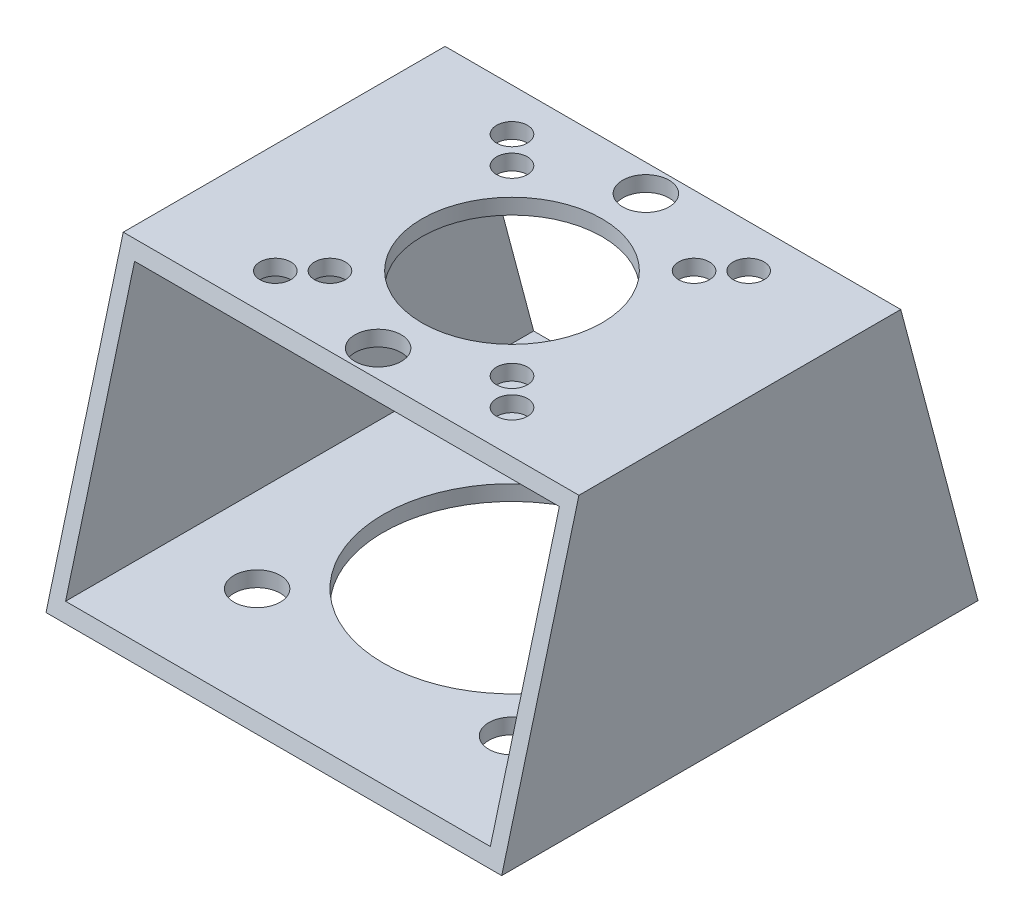
ISO-10303-21;
HEADER;
FILE_DESCRIPTION(('STEP AP214'),'2;1');
FILE_NAME('part.step','',(''),(''),'','','');
FILE_SCHEMA(('AUTOMOTIVE_DESIGN { 1 0 10303 214 1 1 1 1 }'));
ENDSEC;
DATA;
#1=APPLICATION_CONTEXT('core data for automotive mechanical design processes');
#2=APPLICATION_PROTOCOL_DEFINITION('international standard','automotive_design',2000,#1);
#3=PRODUCT_CONTEXT('',#1,'mechanical');
#4=PRODUCT('Part','Part','',(#3));
#5=PRODUCT_RELATED_PRODUCT_CATEGORY('part','',(#4));
#6=PRODUCT_DEFINITION_FORMATION('','',#4);
#7=PRODUCT_DEFINITION_CONTEXT('part definition',#1,'design');
#8=PRODUCT_DEFINITION('design','',#6,#7);
#9=PRODUCT_DEFINITION_SHAPE('','',#8);
#10=(LENGTH_UNIT() NAMED_UNIT(*) SI_UNIT(.MILLI.,.METRE.));
#11=(NAMED_UNIT(*) PLANE_ANGLE_UNIT() SI_UNIT($,.RADIAN.));
#12=(NAMED_UNIT(*) SI_UNIT($,.STERADIAN.) SOLID_ANGLE_UNIT());
#13=UNCERTAINTY_MEASURE_WITH_UNIT(LENGTH_MEASURE(1.E-05),#10,'distance_accuracy_value','');
#14=(GEOMETRIC_REPRESENTATION_CONTEXT(3) GLOBAL_UNCERTAINTY_ASSIGNED_CONTEXT((#13)) GLOBAL_UNIT_ASSIGNED_CONTEXT((#10,
#11,#12)) REPRESENTATION_CONTEXT('',''));
#15=CARTESIAN_POINT('',(0.,0.,0.));
#16=DIRECTION('',(0.,0.,1.));
#17=DIRECTION('',(1.,0.,0.));
#18=AXIS2_PLACEMENT_3D('',#15,#16,#17);
#19=CARTESIAN_POINT('',(88.5,0.,92.5));
#20=DIRECTION('',(-1.,0.,0.));
#21=DIRECTION('',(0.,0.,1.));
#22=AXIS2_PLACEMENT_3D('',#19,#20,#21);
#23=PLANE('',#22);
#24=DIRECTION('',(0.,0.966489539401314,-0.256705999594547));
#25=VECTOR('',#24,1.);
#26=CARTESIAN_POINT('',(88.5,-56.4745004554529,92.5));
#27=LINE('',#26,#25);
#28=CARTESIAN_POINT('',(88.5,-56.4745004554529,92.5));
#29=VERTEX_POINT('',#28);
#30=CARTESIAN_POINT('',(88.5,56.4745004554528,62.5));
#31=VERTEX_POINT('',#30);
#32=EDGE_CURVE('E123',#29,#31,#27,.T.);
#33=ORIENTED_EDGE('',*,*,#32,.F.);
#34=DIRECTION('',(0.,0.,-1.));
#35=VECTOR('',#34,1.);
#36=CARTESIAN_POINT('',(88.5,-56.4745004554529,92.5));
#37=LINE('',#36,#35);
#38=CARTESIAN_POINT('',(88.5,-56.4745004554529,-92.5));
#39=VERTEX_POINT('',#38);
#40=EDGE_CURVE('E279',#29,#39,#37,.T.);
#41=ORIENTED_EDGE('',*,*,#40,.T.);
#42=DIRECTION('',(0.,0.966489539401314,0.256705999594547));
#43=VECTOR('',#42,1.);
#44=CARTESIAN_POINT('',(88.5,-56.4745004554529,-92.5));
#45=LINE('',#44,#43);
#46=CARTESIAN_POINT('',(88.5,56.4745004554528,-62.5));
#47=VERTEX_POINT('',#46);
#48=EDGE_CURVE('E146',#39,#47,#45,.T.);
#49=ORIENTED_EDGE('',*,*,#48,.T.);
#50=DIRECTION('',(0.,0.,-1.));
#51=VECTOR('',#50,1.);
#52=CARTESIAN_POINT('',(88.5,56.4745004554528,92.5));
#53=LINE('',#52,#51);
#54=EDGE_CURVE('E140',#31,#47,#53,.T.);
#55=ORIENTED_EDGE('',*,*,#54,.F.);
#56=EDGE_LOOP('',(#33,#41,#49,#55));
#57=FACE_BOUND('',#56,.T.);
#58=ADVANCED_FACE('F57',(#57),#23,.F.);
#59=CARTESIAN_POINT('',(0.,56.4745004554528,92.5));
#60=DIRECTION('',(0.,-1.,0.));
#61=DIRECTION('',(0.,0.,-1.));
#62=AXIS2_PLACEMENT_3D('',#59,#60,#61);
#63=PLANE('',#62);
#64=CARTESIAN_POINT('',(0.,56.4745004554528,-52.));
#65=DIRECTION('',(0.,-1.,0.));
#66=DIRECTION('',(0.,0.,-1.));
#67=AXIS2_PLACEMENT_3D('',#64,#65,#66);
#68=CIRCLE('',#67,9.);
#69=CARTESIAN_POINT('',(0.,56.4745004554528,-61.));
#70=VERTEX_POINT('',#69);
#71=EDGE_CURVE('E175',#70,#70,#68,.T.);
#72=ORIENTED_EDGE('',*,*,#71,.T.);
#73=EDGE_LOOP('',(#72));
#74=FACE_BOUND('',#73,.T.);
#75=CARTESIAN_POINT('',(0.,56.4745004554528,52.));
#76=DIRECTION('',(0.,1.,0.));
#77=DIRECTION('',(0.,0.,1.));
#78=AXIS2_PLACEMENT_3D('',#75,#76,#77);
#79=CIRCLE('',#78,9.);
#80=CARTESIAN_POINT('',(0.,56.4745004554528,61.));
#81=VERTEX_POINT('',#80);
#82=EDGE_CURVE('E164',#81,#81,#79,.T.);
#83=ORIENTED_EDGE('',*,*,#82,.F.);
#84=EDGE_LOOP('',(#83));
#85=FACE_BOUND('',#84,.T.);
#86=CARTESIAN_POINT('',(35.3553390593274,56.4745004554528,-35.3553390593274));
#87=DIRECTION('',(0.,1.,0.));
#88=DIRECTION('',(0.,0.,-1.));
#89=AXIS2_PLACEMENT_3D('',#86,#87,#88);
#90=CIRCLE('',#89,6.00000000000001);
#91=CARTESIAN_POINT('',(35.3553390593274,56.4745004554528,-41.3553390593274));
#92=VERTEX_POINT('',#91);
#93=EDGE_CURVE('E213',#92,#92,#90,.T.);
#94=ORIENTED_EDGE('',*,*,#93,.F.);
#95=EDGE_LOOP('',(#94));
#96=FACE_BOUND('',#95,.T.);
#97=CARTESIAN_POINT('',(-35.3553390593273,56.4745004554528,-35.3553390593275));
#98=DIRECTION('',(0.,1.,0.));
#99=DIRECTION('',(-1.,0.,0.));
#100=AXIS2_PLACEMENT_3D('',#97,#98,#99);
#101=CIRCLE('',#100,6.00000000000001);
#102=CARTESIAN_POINT('',(-41.3553390593273,56.4745004554528,-35.3553390593275));
#103=VERTEX_POINT('',#102);
#104=EDGE_CURVE('E225',#103,#103,#101,.T.);
#105=ORIENTED_EDGE('',*,*,#104,.F.);
#106=EDGE_LOOP('',(#105));
#107=FACE_BOUND('',#106,.T.);
#108=CARTESIAN_POINT('',(-45.9619407771254,56.4745004554528,-45.9619407771257));
#109=DIRECTION('',(0.,1.,0.));
#110=DIRECTION('',(-1.,0.,0.));
#111=AXIS2_PLACEMENT_3D('',#108,#109,#110);
#112=CIRCLE('',#111,5.99999999999999);
#113=CARTESIAN_POINT('',(-51.9619407771254,56.4745004554528,-45.9619407771258));
#114=VERTEX_POINT('',#113);
#115=EDGE_CURVE('E219',#114,#114,#112,.T.);
#116=ORIENTED_EDGE('',*,*,#115,.F.);
#117=EDGE_LOOP('',(#116));
#118=FACE_BOUND('',#117,.T.);
#119=CARTESIAN_POINT('',(35.355339059327,56.4745004554528,35.3553390593277));
#120=DIRECTION('',(0.,1.,0.));
#121=DIRECTION('',(1.,0.,0.));
#122=AXIS2_PLACEMENT_3D('',#119,#120,#121);
#123=CIRCLE('',#122,6.00000000000001);
#124=CARTESIAN_POINT('',(41.355339059327,56.4745004554528,35.3553390593278));
#125=VERTEX_POINT('',#124);
#126=EDGE_CURVE('E201',#125,#125,#123,.T.);
#127=ORIENTED_EDGE('',*,*,#126,.F.);
#128=EDGE_LOOP('',(#127));
#129=FACE_BOUND('',#128,.T.);
#130=CARTESIAN_POINT('',(45.9619407771251,56.4745004554528,45.9619407771261));
#131=DIRECTION('',(0.,1.,0.));
#132=DIRECTION('',(1.,0.,0.));
#133=AXIS2_PLACEMENT_3D('',#130,#131,#132);
#134=CIRCLE('',#133,5.99999999999999);
#135=CARTESIAN_POINT('',(51.9619407771251,56.4745004554528,45.9619407771261));
#136=VERTEX_POINT('',#135);
#137=EDGE_CURVE('E195',#136,#136,#134,.T.);
#138=ORIENTED_EDGE('',*,*,#137,.F.);
#139=EDGE_LOOP('',(#138));
#140=FACE_BOUND('',#139,.T.);
#141=CARTESIAN_POINT('',(45.9619407771256,56.4745004554528,-45.9619407771256));
#142=DIRECTION('',(0.,1.,0.));
#143=DIRECTION('',(0.,0.,-1.));
#144=AXIS2_PLACEMENT_3D('',#141,#142,#143);
#145=CIRCLE('',#144,5.99999999999999);
#146=CARTESIAN_POINT('',(45.9619407771256,56.4745004554528,-51.9619407771256));
#147=VERTEX_POINT('',#146);
#148=EDGE_CURVE('E207',#147,#147,#145,.T.);
#149=ORIENTED_EDGE('',*,*,#148,.F.);
#150=EDGE_LOOP('',(#149));
#151=FACE_BOUND('',#150,.T.);
#152=CARTESIAN_POINT('',(0.,56.4745004554528,0.));
#153=DIRECTION('',(0.,1.,0.));
#154=DIRECTION('',(0.,0.,1.));
#155=AXIS2_PLACEMENT_3D('',#152,#153,#154);
#156=CIRCLE('',#155,35.);
#157=CARTESIAN_POINT('',(0.,56.4745004554528,35.));
#158=VERTEX_POINT('',#157);
#159=EDGE_CURVE('E267',#158,#158,#156,.T.);
#160=ORIENTED_EDGE('',*,*,#159,.F.);
#161=EDGE_LOOP('',(#160));
#162=FACE_BOUND('',#161,.T.);
#163=CARTESIAN_POINT('',(-45.9619407771256,56.4745004554528,45.9619407771256));
#164=DIRECTION('',(0.,1.,0.));
#165=DIRECTION('',(0.,0.,1.));
#166=AXIS2_PLACEMENT_3D('',#163,#164,#165);
#167=CIRCLE('',#166,5.99999999999999);
#168=CARTESIAN_POINT('',(-45.9619407771256,56.4745004554528,51.9619407771256));
#169=VERTEX_POINT('',#168);
#170=EDGE_CURVE('E255',#169,#169,#167,.T.);
#171=ORIENTED_EDGE('',*,*,#170,.F.);
#172=EDGE_LOOP('',(#171));
#173=FACE_BOUND('',#172,.T.);
#174=CARTESIAN_POINT('',(-35.3553390593274,56.4745004554528,35.3553390593274));
#175=DIRECTION('',(0.,1.,0.));
#176=DIRECTION('',(0.,0.,1.));
#177=AXIS2_PLACEMENT_3D('',#174,#175,#176);
#178=CIRCLE('',#177,6.00000000000001);
#179=CARTESIAN_POINT('',(-35.3553390593274,56.4745004554528,41.3553390593274));
#180=VERTEX_POINT('',#179);
#181=EDGE_CURVE('E261',#180,#180,#178,.T.);
#182=ORIENTED_EDGE('',*,*,#181,.F.);
#183=EDGE_LOOP('',(#182));
#184=FACE_BOUND('',#183,.T.);
#185=DIRECTION('',(-1.,0.,0.));
#186=VECTOR('',#185,1.);
#187=CARTESIAN_POINT('',(88.5,56.4745004554528,62.5));
#188=LINE('',#187,#186);
#189=CARTESIAN_POINT('',(-88.5,56.4745004554528,62.5));
#190=VERTEX_POINT('',#189);
#191=EDGE_CURVE('E126',#31,#190,#188,.T.);
#192=ORIENTED_EDGE('',*,*,#191,.F.);
#193=ORIENTED_EDGE('',*,*,#54,.T.);
#194=DIRECTION('',(-1.,0.,0.));
#195=VECTOR('',#194,1.);
#196=CARTESIAN_POINT('',(88.5,56.4745004554528,-62.5));
#197=LINE('',#196,#195);
#198=CARTESIAN_POINT('',(-88.5,56.4745004554528,-62.5));
#199=VERTEX_POINT('',#198);
#200=EDGE_CURVE('E236',#47,#199,#197,.T.);
#201=ORIENTED_EDGE('',*,*,#200,.T.);
#202=DIRECTION('',(0.,0.,-1.));
#203=VECTOR('',#202,1.);
#204=CARTESIAN_POINT('',(-88.5,56.4745004554528,92.5));
#205=LINE('',#204,#203);
#206=EDGE_CURVE('E142',#190,#199,#205,.T.);
#207=ORIENTED_EDGE('',*,*,#206,.F.);
#208=EDGE_LOOP('',(#192,#193,#201,#207));
#209=FACE_BOUND('',#208,.T.);
#210=ADVANCED_FACE('F138',(#74,#85,#96,#107,#118,#129,#140,#151,#162,#173,#184,#209),#63,.F.);
#211=CARTESIAN_POINT('',(-88.5,0.,92.5));
#212=DIRECTION('',(1.,0.,0.));
#213=DIRECTION('',(0.,0.,-1.));
#214=AXIS2_PLACEMENT_3D('',#211,#212,#213);
#215=PLANE('',#214);
#216=DIRECTION('',(0.,0.966489539401314,-0.256705999594547));
#217=VECTOR('',#216,1.);
#218=CARTESIAN_POINT('',(-88.5,-56.4745004554529,92.5));
#219=LINE('',#218,#217);
#220=CARTESIAN_POINT('',(-88.5,-56.4745004554529,92.5));
#221=VERTEX_POINT('',#220);
#222=EDGE_CURVE('E134',#221,#190,#219,.T.);
#223=ORIENTED_EDGE('',*,*,#222,.T.);
#224=ORIENTED_EDGE('',*,*,#206,.T.);
#225=DIRECTION('',(0.,0.966489539401314,0.256705999594547));
#226=VECTOR('',#225,1.);
#227=CARTESIAN_POINT('',(-88.5,-56.4745004554529,-92.5));
#228=LINE('',#227,#226);
#229=CARTESIAN_POINT('',(-88.5,-56.4745004554529,-92.5));
#230=VERTEX_POINT('',#229);
#231=EDGE_CURVE('E234',#230,#199,#228,.T.);
#232=ORIENTED_EDGE('',*,*,#231,.F.);
#233=DIRECTION('',(0.,0.,-1.));
#234=VECTOR('',#233,1.);
#235=CARTESIAN_POINT('',(-88.5,-56.4745004554529,92.5));
#236=LINE('',#235,#234);
#237=EDGE_CURVE('E150',#221,#230,#236,.T.);
#238=ORIENTED_EDGE('',*,*,#237,.F.);
#239=EDGE_LOOP('',(#223,#224,#232,#238));
#240=FACE_BOUND('',#239,.T.);
#241=ADVANCED_FACE('F288',(#240),#215,.F.);
#242=CARTESIAN_POINT('',(82.5,-50.4745004554529,92.5));
#243=DIRECTION('',(-1.,0.,0.));
#244=DIRECTION('',(0.,0.,1.));
#245=AXIS2_PLACEMENT_3D('',#242,#243,#244);
#246=PLANE('',#245);
#247=DIRECTION('',(0.,0.,-1.));
#248=VECTOR('',#247,1.);
#249=CARTESIAN_POINT('',(82.5,-50.4745004554529,92.5));
#250=LINE('',#249,#248);
#251=CARTESIAN_POINT('',(82.5,-50.4745004554529,90.9063604055959));
#252=VERTEX_POINT('',#251);
#253=CARTESIAN_POINT('',(82.5,-50.4745004554529,-90.9063604055959));
#254=VERTEX_POINT('',#253);
#255=EDGE_CURVE('E270',#252,#254,#250,.T.);
#256=ORIENTED_EDGE('',*,*,#255,.F.);
#257=DIRECTION('',(0.,0.966489539401314,-0.256705999594547));
#258=VECTOR('',#257,1.);
#259=CARTESIAN_POINT('',(82.5,-50.8698882768199,91.0113780201419));
#260=LINE('',#259,#258);
#261=CARTESIAN_POINT('',(82.5,50.4745004554528,64.0936395944041));
#262=VERTEX_POINT('',#261);
#263=EDGE_CURVE('E73',#252,#262,#260,.T.);
#264=ORIENTED_EDGE('',*,*,#263,.T.);
#265=DIRECTION('',(0.,0.,-1.));
#266=VECTOR('',#265,1.);
#267=CARTESIAN_POINT('',(82.5,50.4745004554528,92.5));
#268=LINE('',#267,#266);
#269=CARTESIAN_POINT('',(82.5,50.4745004554528,-64.0936395944041));
#270=VERTEX_POINT('',#269);
#271=EDGE_CURVE('E275',#262,#270,#268,.T.);
#272=ORIENTED_EDGE('',*,*,#271,.T.);
#273=DIRECTION('',(0.,0.966489539401314,0.256705999594547));
#274=VECTOR('',#273,1.);
#275=CARTESIAN_POINT('',(82.5,-4.97071056452768,-78.8202535279923));
#276=LINE('',#275,#274);
#277=EDGE_CURVE('E245',#254,#270,#276,.T.);
#278=ORIENTED_EDGE('',*,*,#277,.F.);
#279=EDGE_LOOP('',(#256,#264,#272,#278));
#280=FACE_BOUND('',#279,.T.);
#281=ADVANCED_FACE('F312',(#280),#246,.T.);
#282=CARTESIAN_POINT('',(-82.5,50.4745004554528,92.5));
#283=DIRECTION('',(0.,-1.,0.));
#284=DIRECTION('',(0.,0.,-1.));
#285=AXIS2_PLACEMENT_3D('',#282,#283,#284);
#286=PLANE('',#285);
#287=CARTESIAN_POINT('',(0.,50.4745004554528,-52.));
#288=DIRECTION('',(0.,-1.,0.));
#289=DIRECTION('',(0.,0.,-1.));
#290=AXIS2_PLACEMENT_3D('',#287,#288,#289);
#291=CIRCLE('',#290,9.);
#292=CARTESIAN_POINT('',(0.,50.4745004554528,-61.));
#293=VERTEX_POINT('',#292);
#294=EDGE_CURVE('E60',#293,#293,#291,.F.);
#295=ORIENTED_EDGE('',*,*,#294,.T.);
#296=EDGE_LOOP('',(#295));
#297=FACE_BOUND('',#296,.T.);
#298=CARTESIAN_POINT('',(0.,50.4745004554528,52.));
#299=DIRECTION('',(0.,-1.,0.));
#300=DIRECTION('',(0.,0.,-1.));
#301=AXIS2_PLACEMENT_3D('',#298,#299,#300);
#302=CIRCLE('',#301,9.);
#303=CARTESIAN_POINT('',(0.,50.4745004554528,43.));
#304=VERTEX_POINT('',#303);
#305=EDGE_CURVE('E161',#304,#304,#302,.T.);
#306=ORIENTED_EDGE('',*,*,#305,.F.);
#307=EDGE_LOOP('',(#306));
#308=FACE_BOUND('',#307,.T.);
#309=CARTESIAN_POINT('',(35.3553390593274,50.4745004554528,-35.3553390593274));
#310=DIRECTION('',(0.,-1.,0.));
#311=DIRECTION('',(0.,0.,-1.));
#312=AXIS2_PLACEMENT_3D('',#309,#310,#311);
#313=CIRCLE('',#312,6.00000000000001);
#314=CARTESIAN_POINT('',(35.3553390593274,50.4745004554528,-41.3553390593274));
#315=VERTEX_POINT('',#314);
#316=EDGE_CURVE('E210',#315,#315,#313,.F.);
#317=ORIENTED_EDGE('',*,*,#316,.T.);
#318=EDGE_LOOP('',(#317));
#319=FACE_BOUND('',#318,.T.);
#320=CARTESIAN_POINT('',(-35.3553390593273,50.4745004554528,-35.3553390593275));
#321=DIRECTION('',(0.,-1.,0.));
#322=DIRECTION('',(0.,0.,-1.));
#323=AXIS2_PLACEMENT_3D('',#320,#321,#322);
#324=CIRCLE('',#323,6.00000000000001);
#325=CARTESIAN_POINT('',(-35.3553390593273,50.4745004554528,-41.3553390593275));
#326=VERTEX_POINT('',#325);
#327=EDGE_CURVE('E222',#326,#326,#324,.F.);
#328=ORIENTED_EDGE('',*,*,#327,.T.);
#329=EDGE_LOOP('',(#328));
#330=FACE_BOUND('',#329,.T.);
#331=CARTESIAN_POINT('',(-45.9619407771254,50.4745004554528,-45.9619407771257));
#332=DIRECTION('',(0.,-1.,0.));
#333=DIRECTION('',(0.,0.,-1.));
#334=AXIS2_PLACEMENT_3D('',#331,#332,#333);
#335=CIRCLE('',#334,5.99999999999999);
#336=CARTESIAN_POINT('',(-45.9619407771254,50.4745004554528,-51.9619407771257));
#337=VERTEX_POINT('',#336);
#338=EDGE_CURVE('E216',#337,#337,#335,.F.);
#339=ORIENTED_EDGE('',*,*,#338,.T.);
#340=EDGE_LOOP('',(#339));
#341=FACE_BOUND('',#340,.T.);
#342=CARTESIAN_POINT('',(35.355339059327,50.4745004554528,35.3553390593277));
#343=DIRECTION('',(0.,-1.,0.));
#344=DIRECTION('',(0.,0.,-1.));
#345=AXIS2_PLACEMENT_3D('',#342,#343,#344);
#346=CIRCLE('',#345,6.00000000000001);
#347=CARTESIAN_POINT('',(35.355339059327,50.4745004554528,29.3553390593277));
#348=VERTEX_POINT('',#347);
#349=EDGE_CURVE('E198',#348,#348,#346,.F.);
#350=ORIENTED_EDGE('',*,*,#349,.T.);
#351=EDGE_LOOP('',(#350));
#352=FACE_BOUND('',#351,.T.);
#353=CARTESIAN_POINT('',(45.9619407771251,50.4745004554528,45.9619407771261));
#354=DIRECTION('',(0.,-1.,0.));
#355=DIRECTION('',(0.,0.,-1.));
#356=AXIS2_PLACEMENT_3D('',#353,#354,#355);
#357=CIRCLE('',#356,5.99999999999999);
#358=CARTESIAN_POINT('',(45.9619407771251,50.4745004554528,39.9619407771261));
#359=VERTEX_POINT('',#358);
#360=EDGE_CURVE('E192',#359,#359,#357,.F.);
#361=ORIENTED_EDGE('',*,*,#360,.T.);
#362=EDGE_LOOP('',(#361));
#363=FACE_BOUND('',#362,.T.);
#364=CARTESIAN_POINT('',(45.9619407771256,50.4745004554528,-45.9619407771256));
#365=DIRECTION('',(0.,-1.,0.));
#366=DIRECTION('',(0.,0.,-1.));
#367=AXIS2_PLACEMENT_3D('',#364,#365,#366);
#368=CIRCLE('',#367,5.99999999999999);
#369=CARTESIAN_POINT('',(45.9619407771256,50.4745004554528,-51.9619407771256));
#370=VERTEX_POINT('',#369);
#371=EDGE_CURVE('E204',#370,#370,#368,.F.);
#372=ORIENTED_EDGE('',*,*,#371,.T.);
#373=EDGE_LOOP('',(#372));
#374=FACE_BOUND('',#373,.T.);
#375=CARTESIAN_POINT('',(-35.3553390593274,50.4745004554528,35.3553390593274));
#376=DIRECTION('',(0.,-1.,0.));
#377=DIRECTION('',(0.,0.,-1.));
#378=AXIS2_PLACEMENT_3D('',#375,#376,#377);
#379=CIRCLE('',#378,6.00000000000001);
#380=CARTESIAN_POINT('',(-35.3553390593274,50.4745004554528,29.3553390593274));
#381=VERTEX_POINT('',#380);
#382=EDGE_CURVE('E258',#381,#381,#379,.F.);
#383=ORIENTED_EDGE('',*,*,#382,.T.);
#384=EDGE_LOOP('',(#383));
#385=FACE_BOUND('',#384,.T.);
#386=CARTESIAN_POINT('',(-45.9619407771256,50.4745004554528,45.9619407771256));
#387=DIRECTION('',(0.,-1.,0.));
#388=DIRECTION('',(0.,0.,-1.));
#389=AXIS2_PLACEMENT_3D('',#386,#387,#388);
#390=CIRCLE('',#389,5.99999999999999);
#391=CARTESIAN_POINT('',(-45.9619407771256,50.4745004554528,39.9619407771256));
#392=VERTEX_POINT('',#391);
#393=EDGE_CURVE('E160',#392,#392,#390,.F.);
#394=ORIENTED_EDGE('',*,*,#393,.T.);
#395=EDGE_LOOP('',(#394));
#396=FACE_BOUND('',#395,.T.);
#397=CARTESIAN_POINT('',(0.,50.4745004554528,0.));
#398=DIRECTION('',(0.,-1.,0.));
#399=DIRECTION('',(0.,0.,-1.));
#400=AXIS2_PLACEMENT_3D('',#397,#398,#399);
#401=CIRCLE('',#400,35.);
#402=CARTESIAN_POINT('',(0.,50.4745004554528,-35.));
#403=VERTEX_POINT('',#402);
#404=EDGE_CURVE('E264',#403,#403,#401,.F.);
#405=ORIENTED_EDGE('',*,*,#404,.T.);
#406=EDGE_LOOP('',(#405));
#407=FACE_BOUND('',#406,.T.);
#408=ORIENTED_EDGE('',*,*,#271,.F.);
#409=DIRECTION('',(-1.,0.,0.));
#410=VECTOR('',#409,1.);
#411=CARTESIAN_POINT('',(-82.5,50.4745004554528,64.0936395944041));
#412=LINE('',#411,#410);
#413=CARTESIAN_POINT('',(-82.5,50.4745004554528,64.0936395944041));
#414=VERTEX_POINT('',#413);
#415=EDGE_CURVE('E230',#262,#414,#412,.T.);
#416=ORIENTED_EDGE('',*,*,#415,.T.);
#417=DIRECTION('',(0.,0.,-1.));
#418=VECTOR('',#417,1.);
#419=CARTESIAN_POINT('',(-82.5,50.4745004554528,92.5));
#420=LINE('',#419,#418);
#421=CARTESIAN_POINT('',(-82.5,50.4745004554528,-64.0936395944041));
#422=VERTEX_POINT('',#421);
#423=EDGE_CURVE('E273',#414,#422,#420,.T.);
#424=ORIENTED_EDGE('',*,*,#423,.T.);
#425=DIRECTION('',(-1.,0.,0.));
#426=VECTOR('',#425,1.);
#427=CARTESIAN_POINT('',(-82.5,50.4745004554528,-64.0936395944041));
#428=LINE('',#427,#426);
#429=EDGE_CURVE('E242',#270,#422,#428,.T.);
#430=ORIENTED_EDGE('',*,*,#429,.F.);
#431=EDGE_LOOP('',(#408,#416,#424,#430));
#432=FACE_BOUND('',#431,.T.);
#433=ADVANCED_FACE('F324',(#297,#308,#319,#330,#341,#352,#363,#374,#385,#396,#407,#432),#286,.T.);
#434=CARTESIAN_POINT('',(-82.5,-50.4745004554529,92.5));
#435=DIRECTION('',(1.,0.,0.));
#436=DIRECTION('',(0.,0.,-1.));
#437=AXIS2_PLACEMENT_3D('',#434,#435,#436);
#438=PLANE('',#437);
#439=ORIENTED_EDGE('',*,*,#423,.F.);
#440=DIRECTION('',(0.,-0.966489539401314,0.256705999594547));
#441=VECTOR('',#440,1.);
#442=CARTESIAN_POINT('',(-82.5,-50.8698882768199,91.0113780201419));
#443=LINE('',#442,#441);
#444=CARTESIAN_POINT('',(-82.5,-50.4745004554529,90.9063604055959));
#445=VERTEX_POINT('',#444);
#446=EDGE_CURVE('E143',#414,#445,#443,.T.);
#447=ORIENTED_EDGE('',*,*,#446,.T.);
#448=DIRECTION('',(0.,0.,-1.));
#449=VECTOR('',#448,1.);
#450=CARTESIAN_POINT('',(-82.5,-50.4745004554529,92.5));
#451=LINE('',#450,#449);
#452=CARTESIAN_POINT('',(-82.5,-50.4745004554529,-90.9063604055959));
#453=VERTEX_POINT('',#452);
#454=EDGE_CURVE('E80',#445,#453,#451,.T.);
#455=ORIENTED_EDGE('',*,*,#454,.T.);
#456=DIRECTION('',(0.,-0.966489539401314,-0.256705999594547));
#457=VECTOR('',#456,1.);
#458=CARTESIAN_POINT('',(-82.5,-4.97071056452768,-78.8202535279923));
#459=LINE('',#458,#457);
#460=EDGE_CURVE('E240',#422,#453,#459,.T.);
#461=ORIENTED_EDGE('',*,*,#460,.F.);
#462=EDGE_LOOP('',(#439,#447,#455,#461));
#463=FACE_BOUND('',#462,.T.);
#464=ADVANCED_FACE('F328',(#463),#438,.T.);
#465=CARTESIAN_POINT('',(-82.5,-50.4745004554529,92.5));
#466=DIRECTION('',(0.,1.,0.));
#467=DIRECTION('',(0.,0.,1.));
#468=AXIS2_PLACEMENT_3D('',#465,#466,#467);
#469=PLANE('',#468);
#470=CARTESIAN_POINT('',(49.4974746830583,-50.4745004554529,49.4974746830583));
#471=DIRECTION('',(0.,1.,0.));
#472=DIRECTION('',(0.,0.,1.));
#473=AXIS2_PLACEMENT_3D('',#470,#471,#472);
#474=CIRCLE('',#473,9.);
#475=CARTESIAN_POINT('',(49.4974746830583,-50.4745004554529,58.4974746830583));
#476=VERTEX_POINT('',#475);
#477=EDGE_CURVE('E189',#476,#476,#474,.T.);
#478=ORIENTED_EDGE('',*,*,#477,.F.);
#479=EDGE_LOOP('',(#478));
#480=FACE_BOUND('',#479,.T.);
#481=CARTESIAN_POINT('',(49.4974746830585,-50.4745004554529,-49.4974746830582));
#482=DIRECTION('',(0.,1.,0.));
#483=DIRECTION('',(0.,0.,1.));
#484=AXIS2_PLACEMENT_3D('',#481,#482,#483);
#485=CIRCLE('',#484,9.);
#486=CARTESIAN_POINT('',(49.4974746830585,-50.4745004554529,-40.4974746830582));
#487=VERTEX_POINT('',#486);
#488=EDGE_CURVE('E186',#487,#487,#485,.T.);
#489=ORIENTED_EDGE('',*,*,#488,.F.);
#490=EDGE_LOOP('',(#489));
#491=FACE_BOUND('',#490,.T.);
#492=CARTESIAN_POINT('',(-49.4974746830589,-50.4745004554529,49.4974746830578));
#493=DIRECTION('',(0.,1.,0.));
#494=DIRECTION('',(0.,0.,1.));
#495=AXIS2_PLACEMENT_3D('',#492,#493,#494);
#496=CIRCLE('',#495,9.);
#497=CARTESIAN_POINT('',(-49.4974746830589,-50.4745004554529,58.4974746830578));
#498=VERTEX_POINT('',#497);
#499=EDGE_CURVE('E183',#498,#498,#496,.T.);
#500=ORIENTED_EDGE('',*,*,#499,.F.);
#501=EDGE_LOOP('',(#500));
#502=FACE_BOUND('',#501,.T.);
#503=CARTESIAN_POINT('',(-49.4974746830583,-50.4745004554529,-49.4974746830583));
#504=DIRECTION('',(0.,1.,0.));
#505=DIRECTION('',(0.,0.,1.));
#506=AXIS2_PLACEMENT_3D('',#503,#504,#505);
#507=CIRCLE('',#506,9.);
#508=CARTESIAN_POINT('',(-49.4974746830583,-50.4745004554529,-40.4974746830583));
#509=VERTEX_POINT('',#508);
#510=EDGE_CURVE('E157',#509,#509,#507,.T.);
#511=ORIENTED_EDGE('',*,*,#510,.F.);
#512=EDGE_LOOP('',(#511));
#513=FACE_BOUND('',#512,.T.);
#514=CARTESIAN_POINT('',(0.,-50.4745004554529,0.));
#515=DIRECTION('',(0.,1.,0.));
#516=DIRECTION('',(0.,0.,1.));
#517=AXIS2_PLACEMENT_3D('',#514,#515,#516);
#518=CIRCLE('',#517,50.);
#519=CARTESIAN_POINT('',(0.,-50.4745004554529,50.));
#520=VERTEX_POINT('',#519);
#521=EDGE_CURVE('E154',#520,#520,#518,.T.);
#522=ORIENTED_EDGE('',*,*,#521,.F.);
#523=EDGE_LOOP('',(#522));
#524=FACE_BOUND('',#523,.T.);
#525=ORIENTED_EDGE('',*,*,#454,.F.);
#526=DIRECTION('',(1.,0.,0.));
#527=VECTOR('',#526,1.);
#528=CARTESIAN_POINT('',(-82.5,-50.4745004554529,90.9063604055959));
#529=LINE('',#528,#527);
#530=EDGE_CURVE('E12',#445,#252,#529,.T.);
#531=ORIENTED_EDGE('',*,*,#530,.T.);
#532=ORIENTED_EDGE('',*,*,#255,.T.);
#533=DIRECTION('',(1.,0.,0.));
#534=VECTOR('',#533,1.);
#535=CARTESIAN_POINT('',(-82.5,-50.4745004554529,-90.9063604055959));
#536=LINE('',#535,#534);
#537=EDGE_CURVE('E65',#453,#254,#536,.T.);
#538=ORIENTED_EDGE('',*,*,#537,.F.);
#539=EDGE_LOOP('',(#525,#531,#532,#538));
#540=FACE_BOUND('',#539,.T.);
#541=ADVANCED_FACE('F320',(#480,#491,#502,#513,#524,#540),#469,.T.);
#542=CARTESIAN_POINT('',(0.,-56.4745004554529,92.5));
#543=DIRECTION('',(0.,1.,0.));
#544=DIRECTION('',(0.,0.,1.));
#545=AXIS2_PLACEMENT_3D('',#542,#543,#544);
#546=PLANE('',#545);
#547=CARTESIAN_POINT('',(49.4974746830583,-56.4745004554529,49.4974746830583));
#548=DIRECTION('',(0.,-1.,0.));
#549=DIRECTION('',(0.,0.,1.));
#550=AXIS2_PLACEMENT_3D('',#547,#548,#549);
#551=CIRCLE('',#550,9.);
#552=CARTESIAN_POINT('',(49.4974746830583,-56.4745004554529,58.4974746830583));
#553=VERTEX_POINT('',#552);
#554=EDGE_CURVE('E168',#553,#553,#551,.T.);
#555=ORIENTED_EDGE('',*,*,#554,.F.);
#556=EDGE_LOOP('',(#555));
#557=FACE_BOUND('',#556,.T.);
#558=CARTESIAN_POINT('',(49.4974746830585,-56.4745004554529,-49.4974746830582));
#559=DIRECTION('',(0.,-1.,0.));
#560=DIRECTION('',(1.,0.,0.));
#561=AXIS2_PLACEMENT_3D('',#558,#559,#560);
#562=CIRCLE('',#561,9.);
#563=CARTESIAN_POINT('',(58.4974746830585,-56.4745004554529,-49.4974746830581));
#564=VERTEX_POINT('',#563);
#565=EDGE_CURVE('E180',#564,#564,#562,.T.);
#566=ORIENTED_EDGE('',*,*,#565,.F.);
#567=EDGE_LOOP('',(#566));
#568=FACE_BOUND('',#567,.T.);
#569=CARTESIAN_POINT('',(-49.4974746830589,-56.4745004554529,49.4974746830578));
#570=DIRECTION('',(0.,-1.,0.));
#571=DIRECTION('',(-1.,0.,0.));
#572=AXIS2_PLACEMENT_3D('',#569,#570,#571);
#573=CIRCLE('',#572,9.);
#574=CARTESIAN_POINT('',(-58.4974746830589,-56.4745004554529,49.4974746830577));
#575=VERTEX_POINT('',#574);
#576=EDGE_CURVE('E163',#575,#575,#573,.T.);
#577=ORIENTED_EDGE('',*,*,#576,.F.);
#578=EDGE_LOOP('',(#577));
#579=FACE_BOUND('',#578,.T.);
#580=CARTESIAN_POINT('',(-49.4974746830583,-56.4745004554529,-49.4974746830583));
#581=DIRECTION('',(0.,-1.,0.));
#582=DIRECTION('',(0.,0.,-1.));
#583=AXIS2_PLACEMENT_3D('',#580,#581,#582);
#584=CIRCLE('',#583,9.);
#585=CARTESIAN_POINT('',(-49.4974746830583,-56.4745004554529,-58.4974746830583));
#586=VERTEX_POINT('',#585);
#587=EDGE_CURVE('E248',#586,#586,#584,.T.);
#588=ORIENTED_EDGE('',*,*,#587,.F.);
#589=EDGE_LOOP('',(#588));
#590=FACE_BOUND('',#589,.T.);
#591=CARTESIAN_POINT('',(0.,-56.4745004554529,0.));
#592=DIRECTION('',(0.,-1.,0.));
#593=DIRECTION('',(0.,0.,-1.));
#594=AXIS2_PLACEMENT_3D('',#591,#592,#593);
#595=CIRCLE('',#594,50.);
#596=CARTESIAN_POINT('',(0.,-56.4745004554529,-50.));
#597=VERTEX_POINT('',#596);
#598=EDGE_CURVE('E158',#597,#597,#595,.T.);
#599=ORIENTED_EDGE('',*,*,#598,.F.);
#600=EDGE_LOOP('',(#599));
#601=FACE_BOUND('',#600,.T.);
#602=DIRECTION('',(1.,0.,0.));
#603=VECTOR('',#602,1.);
#604=CARTESIAN_POINT('',(0.,-56.4745004554529,-92.5));
#605=LINE('',#604,#603);
#606=EDGE_CURVE('E277',#230,#39,#605,.T.);
#607=ORIENTED_EDGE('',*,*,#606,.T.);
#608=ORIENTED_EDGE('',*,*,#40,.F.);
#609=DIRECTION('',(1.,0.,0.));
#610=VECTOR('',#609,1.);
#611=CARTESIAN_POINT('',(0.,-56.4745004554529,92.5));
#612=LINE('',#611,#610);
#613=EDGE_CURVE('E129',#221,#29,#612,.T.);
#614=ORIENTED_EDGE('',*,*,#613,.F.);
#615=ORIENTED_EDGE('',*,*,#237,.T.);
#616=EDGE_LOOP('',(#607,#608,#614,#615));
#617=FACE_BOUND('',#616,.T.);
#618=ADVANCED_FACE('F285',(#557,#568,#579,#590,#601,#617),#546,.F.);
#619=CARTESIAN_POINT('',(0.,-56.4755004554529,0.));
#620=DIRECTION('',(0.,1.,0.));
#621=DIRECTION('',(0.,0.,1.));
#622=AXIS2_PLACEMENT_3D('',#619,#620,#621);
#623=CYLINDRICAL_SURFACE('',#622,35.);
#624=ORIENTED_EDGE('',*,*,#404,.F.);
#625=EDGE_LOOP('',(#624));
#626=FACE_BOUND('',#625,.T.);
#627=ORIENTED_EDGE('',*,*,#159,.T.);
#628=EDGE_LOOP('',(#627));
#629=FACE_BOUND('',#628,.T.);
#630=ADVANCED_FACE('F319',(#626,#629),#623,.F.);
#631=CARTESIAN_POINT('',(-45.9619407771256,-56.4755004554529,45.9619407771256));
#632=DIRECTION('',(0.,1.,0.));
#633=DIRECTION('',(0.,0.,1.));
#634=AXIS2_PLACEMENT_3D('',#631,#632,#633);
#635=CYLINDRICAL_SURFACE('',#634,5.99999999999999);
#636=ORIENTED_EDGE('',*,*,#393,.F.);
#637=EDGE_LOOP('',(#636));
#638=FACE_BOUND('',#637,.T.);
#639=ORIENTED_EDGE('',*,*,#170,.T.);
#640=EDGE_LOOP('',(#639));
#641=FACE_BOUND('',#640,.T.);
#642=ADVANCED_FACE('F337',(#638,#641),#635,.F.);
#643=CARTESIAN_POINT('',(-35.3553390593274,-56.4755004554529,35.3553390593274));
#644=DIRECTION('',(0.,1.,0.));
#645=DIRECTION('',(0.,0.,1.));
#646=AXIS2_PLACEMENT_3D('',#643,#644,#645);
#647=CYLINDRICAL_SURFACE('',#646,6.00000000000001);
#648=ORIENTED_EDGE('',*,*,#382,.F.);
#649=EDGE_LOOP('',(#648));
#650=FACE_BOUND('',#649,.T.);
#651=ORIENTED_EDGE('',*,*,#181,.T.);
#652=EDGE_LOOP('',(#651));
#653=FACE_BOUND('',#652,.T.);
#654=ADVANCED_FACE('F339',(#650,#653),#647,.F.);
#655=CARTESIAN_POINT('',(0.,-46.4745004554528,0.));
#656=DIRECTION('',(0.,-1.,0.));
#657=DIRECTION('',(0.,0.,-1.));
#658=AXIS2_PLACEMENT_3D('',#655,#656,#657);
#659=CYLINDRICAL_SURFACE('',#658,50.);
#660=ORIENTED_EDGE('',*,*,#521,.T.);
#661=EDGE_LOOP('',(#660));
#662=FACE_BOUND('',#661,.T.);
#663=ORIENTED_EDGE('',*,*,#598,.T.);
#664=EDGE_LOOP('',(#663));
#665=FACE_BOUND('',#664,.T.);
#666=ADVANCED_FACE('F301',(#662,#665),#659,.F.);
#667=CARTESIAN_POINT('',(-49.4974746830583,-46.4745004554528,-49.4974746830583));
#668=DIRECTION('',(0.,-1.,0.));
#669=DIRECTION('',(0.,0.,-1.));
#670=AXIS2_PLACEMENT_3D('',#667,#668,#669);
#671=CYLINDRICAL_SURFACE('',#670,9.);
#672=ORIENTED_EDGE('',*,*,#510,.T.);
#673=EDGE_LOOP('',(#672));
#674=FACE_BOUND('',#673,.T.);
#675=ORIENTED_EDGE('',*,*,#587,.T.);
#676=EDGE_LOOP('',(#675));
#677=FACE_BOUND('',#676,.T.);
#678=ADVANCED_FACE('F292',(#674,#677),#671,.F.);
#679=CARTESIAN_POINT('',(88.5,-56.4745004554529,-92.5));
#680=DIRECTION('',(0.,-0.256705999594547,0.966489539401314));
#681=DIRECTION('',(0.,-0.966489539401314,-0.256705999594547));
#682=AXIS2_PLACEMENT_3D('',#679,#680,#681);
#683=PLANE('',#682);
#684=ORIENTED_EDGE('',*,*,#277,.T.);
#685=ORIENTED_EDGE('',*,*,#429,.T.);
#686=ORIENTED_EDGE('',*,*,#460,.T.);
#687=ORIENTED_EDGE('',*,*,#537,.T.);
#688=EDGE_LOOP('',(#684,#685,#686,#687));
#689=FACE_BOUND('',#688,.T.);
#690=ORIENTED_EDGE('',*,*,#231,.T.);
#691=ORIENTED_EDGE('',*,*,#200,.F.);
#692=ORIENTED_EDGE('',*,*,#48,.F.);
#693=ORIENTED_EDGE('',*,*,#606,.F.);
#694=EDGE_LOOP('',(#690,#691,#692,#693));
#695=FACE_BOUND('',#694,.T.);
#696=ADVANCED_FACE('F290',(#689,#695),#683,.F.);
#697=CARTESIAN_POINT('',(88.5,-56.4745004554529,92.5));
#698=DIRECTION('',(0.,0.256705999594547,0.966489539401314));
#699=DIRECTION('',(0.,-0.966489539401314,0.256705999594547));
#700=AXIS2_PLACEMENT_3D('',#697,#698,#699);
#701=PLANE('',#700);
#702=ORIENTED_EDGE('',*,*,#530,.F.);
#703=ORIENTED_EDGE('',*,*,#446,.F.);
#704=ORIENTED_EDGE('',*,*,#415,.F.);
#705=ORIENTED_EDGE('',*,*,#263,.F.);
#706=EDGE_LOOP('',(#702,#703,#704,#705));
#707=FACE_BOUND('',#706,.T.);
#708=ORIENTED_EDGE('',*,*,#222,.F.);
#709=ORIENTED_EDGE('',*,*,#613,.T.);
#710=ORIENTED_EDGE('',*,*,#32,.T.);
#711=ORIENTED_EDGE('',*,*,#191,.T.);
#712=EDGE_LOOP('',(#708,#709,#710,#711));
#713=FACE_BOUND('',#712,.T.);
#714=ADVANCED_FACE('F125',(#707,#713),#701,.T.);
#715=CARTESIAN_POINT('',(45.9619407771256,-56.4755004554529,-45.9619407771256));
#716=DIRECTION('',(0.,1.,0.));
#717=DIRECTION('',(0.,0.,1.));
#718=AXIS2_PLACEMENT_3D('',#715,#716,#717);
#719=CYLINDRICAL_SURFACE('',#718,5.99999999999999);
#720=ORIENTED_EDGE('',*,*,#371,.F.);
#721=EDGE_LOOP('',(#720));
#722=FACE_BOUND('',#721,.T.);
#723=ORIENTED_EDGE('',*,*,#148,.T.);
#724=EDGE_LOOP('',(#723));
#725=FACE_BOUND('',#724,.T.);
#726=ADVANCED_FACE('F299',(#722,#725),#719,.F.);
#727=CARTESIAN_POINT('',(45.9619407771251,-56.4755004554529,45.9619407771261));
#728=DIRECTION('',(0.,1.,0.));
#729=DIRECTION('',(0.,0.,1.));
#730=AXIS2_PLACEMENT_3D('',#727,#728,#729);
#731=CYLINDRICAL_SURFACE('',#730,5.99999999999999);
#732=ORIENTED_EDGE('',*,*,#360,.F.);
#733=EDGE_LOOP('',(#732));
#734=FACE_BOUND('',#733,.T.);
#735=ORIENTED_EDGE('',*,*,#137,.T.);
#736=EDGE_LOOP('',(#735));
#737=FACE_BOUND('',#736,.T.);
#738=ADVANCED_FACE('F425',(#734,#737),#731,.F.);
#739=CARTESIAN_POINT('',(35.355339059327,-56.4755004554529,35.3553390593277));
#740=DIRECTION('',(0.,1.,0.));
#741=DIRECTION('',(0.,0.,1.));
#742=AXIS2_PLACEMENT_3D('',#739,#740,#741);
#743=CYLINDRICAL_SURFACE('',#742,6.00000000000001);
#744=ORIENTED_EDGE('',*,*,#349,.F.);
#745=EDGE_LOOP('',(#744));
#746=FACE_BOUND('',#745,.T.);
#747=ORIENTED_EDGE('',*,*,#126,.T.);
#748=EDGE_LOOP('',(#747));
#749=FACE_BOUND('',#748,.T.);
#750=ADVANCED_FACE('F435',(#746,#749),#743,.F.);
#751=CARTESIAN_POINT('',(-45.9619407771254,-56.4755004554529,-45.9619407771257));
#752=DIRECTION('',(0.,1.,0.));
#753=DIRECTION('',(0.,0.,1.));
#754=AXIS2_PLACEMENT_3D('',#751,#752,#753);
#755=CYLINDRICAL_SURFACE('',#754,5.99999999999999);
#756=ORIENTED_EDGE('',*,*,#338,.F.);
#757=EDGE_LOOP('',(#756));
#758=FACE_BOUND('',#757,.T.);
#759=ORIENTED_EDGE('',*,*,#115,.T.);
#760=EDGE_LOOP('',(#759));
#761=FACE_BOUND('',#760,.T.);
#762=ADVANCED_FACE('F445',(#758,#761),#755,.F.);
#763=CARTESIAN_POINT('',(-35.3553390593273,-56.4755004554529,-35.3553390593275));
#764=DIRECTION('',(0.,1.,0.));
#765=DIRECTION('',(0.,0.,1.));
#766=AXIS2_PLACEMENT_3D('',#763,#764,#765);
#767=CYLINDRICAL_SURFACE('',#766,6.00000000000001);
#768=ORIENTED_EDGE('',*,*,#327,.F.);
#769=EDGE_LOOP('',(#768));
#770=FACE_BOUND('',#769,.T.);
#771=ORIENTED_EDGE('',*,*,#104,.T.);
#772=EDGE_LOOP('',(#771));
#773=FACE_BOUND('',#772,.T.);
#774=ADVANCED_FACE('F455',(#770,#773),#767,.F.);
#775=CARTESIAN_POINT('',(35.3553390593274,-56.4755004554529,-35.3553390593274));
#776=DIRECTION('',(0.,1.,0.));
#777=DIRECTION('',(0.,0.,1.));
#778=AXIS2_PLACEMENT_3D('',#775,#776,#777);
#779=CYLINDRICAL_SURFACE('',#778,6.00000000000001);
#780=ORIENTED_EDGE('',*,*,#316,.F.);
#781=EDGE_LOOP('',(#780));
#782=FACE_BOUND('',#781,.T.);
#783=ORIENTED_EDGE('',*,*,#93,.T.);
#784=EDGE_LOOP('',(#783));
#785=FACE_BOUND('',#784,.T.);
#786=ADVANCED_FACE('F465',(#782,#785),#779,.F.);
#787=CARTESIAN_POINT('',(-49.4974746830589,-46.4745004554528,49.4974746830578));
#788=DIRECTION('',(0.,-1.,0.));
#789=DIRECTION('',(0.,0.,-1.));
#790=AXIS2_PLACEMENT_3D('',#787,#788,#789);
#791=CYLINDRICAL_SURFACE('',#790,9.);
#792=ORIENTED_EDGE('',*,*,#499,.T.);
#793=EDGE_LOOP('',(#792));
#794=FACE_BOUND('',#793,.T.);
#795=ORIENTED_EDGE('',*,*,#576,.T.);
#796=EDGE_LOOP('',(#795));
#797=FACE_BOUND('',#796,.T.);
#798=ADVANCED_FACE('F475',(#794,#797),#791,.F.);
#799=CARTESIAN_POINT('',(49.4974746830585,-46.4745004554528,-49.4974746830582));
#800=DIRECTION('',(0.,-1.,0.));
#801=DIRECTION('',(0.,0.,-1.));
#802=AXIS2_PLACEMENT_3D('',#799,#800,#801);
#803=CYLINDRICAL_SURFACE('',#802,9.);
#804=ORIENTED_EDGE('',*,*,#488,.T.);
#805=EDGE_LOOP('',(#804));
#806=FACE_BOUND('',#805,.T.);
#807=ORIENTED_EDGE('',*,*,#565,.T.);
#808=EDGE_LOOP('',(#807));
#809=FACE_BOUND('',#808,.T.);
#810=ADVANCED_FACE('F485',(#806,#809),#803,.F.);
#811=CARTESIAN_POINT('',(49.4974746830583,-46.4745004554528,49.4974746830583));
#812=DIRECTION('',(0.,-1.,0.));
#813=DIRECTION('',(0.,0.,-1.));
#814=AXIS2_PLACEMENT_3D('',#811,#812,#813);
#815=CYLINDRICAL_SURFACE('',#814,9.);
#816=ORIENTED_EDGE('',*,*,#477,.T.);
#817=EDGE_LOOP('',(#816));
#818=FACE_BOUND('',#817,.T.);
#819=ORIENTED_EDGE('',*,*,#554,.T.);
#820=EDGE_LOOP('',(#819));
#821=FACE_BOUND('',#820,.T.);
#822=ADVANCED_FACE('F495',(#818,#821),#815,.F.);
#823=CARTESIAN_POINT('',(0.,46.4745004554528,52.));
#824=DIRECTION('',(0.,1.,0.));
#825=DIRECTION('',(0.,0.,1.));
#826=AXIS2_PLACEMENT_3D('',#823,#824,#825);
#827=CYLINDRICAL_SURFACE('',#826,9.);
#828=ORIENTED_EDGE('',*,*,#305,.T.);
#829=EDGE_LOOP('',(#828));
#830=FACE_BOUND('',#829,.T.);
#831=ORIENTED_EDGE('',*,*,#82,.T.);
#832=EDGE_LOOP('',(#831));
#833=FACE_BOUND('',#832,.T.);
#834=ADVANCED_FACE('F505',(#830,#833),#827,.F.);
#835=CARTESIAN_POINT('',(0.,46.4745004554528,-52.));
#836=DIRECTION('',(0.,1.,0.));
#837=DIRECTION('',(0.,0.,1.));
#838=AXIS2_PLACEMENT_3D('',#835,#836,#837);
#839=CYLINDRICAL_SURFACE('',#838,9.);
#840=ORIENTED_EDGE('',*,*,#294,.F.);
#841=EDGE_LOOP('',(#840));
#842=FACE_BOUND('',#841,.T.);
#843=ORIENTED_EDGE('',*,*,#71,.F.);
#844=EDGE_LOOP('',(#843));
#845=FACE_BOUND('',#844,.T.);
#846=ADVANCED_FACE('F514',(#842,#845),#839,.F.);
#847=CLOSED_SHELL('',(#58,#210,#241,#281,#433,#464,#541,#618,#630,#642,#654,#666,#678,#696,#714,
#726,#738,#750,#762,#774,#786,#798,#810,#822,#834,#846));
#848=MANIFOLD_SOLID_BREP('B2',#847);
#849=ADVANCED_BREP_SHAPE_REPRESENTATION('',(#18,#848),#14);
#850=SHAPE_DEFINITION_REPRESENTATION(#9,#849);
ENDSEC;
END-ISO-10303-21;
